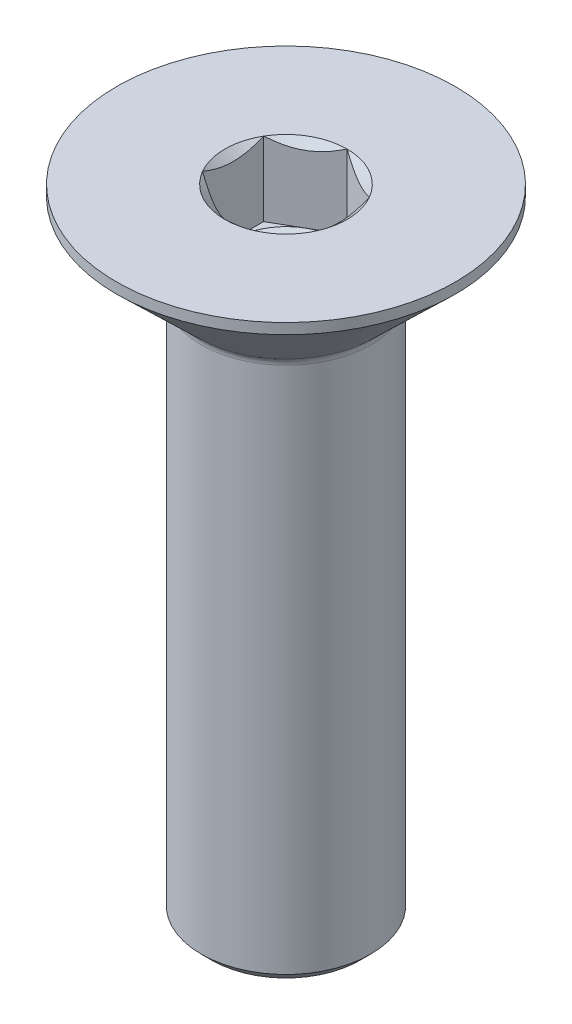
ISO-10303-21;
HEADER;
FILE_DESCRIPTION(('STEP AP214'),'2;1');
FILE_NAME('part.step','',(''),(''),'','','');
FILE_SCHEMA(('AUTOMOTIVE_DESIGN { 1 0 10303 214 1 1 1 1 }'));
ENDSEC;
DATA;
#1=APPLICATION_CONTEXT('core data for automotive mechanical design processes');
#2=APPLICATION_PROTOCOL_DEFINITION('international standard','automotive_design',2000,#1);
#3=PRODUCT_CONTEXT('',#1,'mechanical');
#4=PRODUCT('Part','Part','',(#3));
#5=PRODUCT_RELATED_PRODUCT_CATEGORY('part','',(#4));
#6=PRODUCT_DEFINITION_FORMATION('','',#4);
#7=PRODUCT_DEFINITION_CONTEXT('part definition',#1,'design');
#8=PRODUCT_DEFINITION('design','',#6,#7);
#9=PRODUCT_DEFINITION_SHAPE('','',#8);
#10=(LENGTH_UNIT() NAMED_UNIT(*) SI_UNIT(.MILLI.,.METRE.));
#11=(NAMED_UNIT(*) PLANE_ANGLE_UNIT() SI_UNIT($,.RADIAN.));
#12=(NAMED_UNIT(*) SI_UNIT($,.STERADIAN.) SOLID_ANGLE_UNIT());
#13=UNCERTAINTY_MEASURE_WITH_UNIT(LENGTH_MEASURE(1.E-05),#10,'distance_accuracy_value','');
#14=(GEOMETRIC_REPRESENTATION_CONTEXT(3) GLOBAL_UNCERTAINTY_ASSIGNED_CONTEXT((#13)) GLOBAL_UNIT_ASSIGNED_CONTEXT((#10,
#11,#12)) REPRESENTATION_CONTEXT('',''));
#15=CARTESIAN_POINT('',(0.,0.,0.));
#16=DIRECTION('',(0.,0.,1.));
#17=DIRECTION('',(1.,0.,0.));
#18=AXIS2_PLACEMENT_3D('',#15,#16,#17);
#19=CARTESIAN_POINT('',(0.,-3.5,0.));
#20=DIRECTION('',(0.,1.,0.));
#21=DIRECTION('',(0.,0.,1.));
#22=AXIS2_PLACEMENT_3D('',#19,#20,#21);
#23=PLANE('',#22);
#24=CARTESIAN_POINT('',(0.,-3.5,0.));
#25=DIRECTION('',(0.,1.,0.));
#26=DIRECTION('',(0.,0.,1.));
#27=AXIS2_PLACEMENT_3D('',#24,#25,#26);
#28=CIRCLE('',#27,2.5);
#29=CARTESIAN_POINT('',(1.25,-3.5,2.1650635094611));
#30=VERTEX_POINT('',#29);
#31=CARTESIAN_POINT('',(2.5,-3.5,0.));
#32=VERTEX_POINT('',#31);
#33=EDGE_CURVE('E161',#30,#32,#28,.T.);
#34=ORIENTED_EDGE('',*,*,#33,.F.);
#35=DIRECTION('',(0.866025403784439,0.,-0.5));
#36=VECTOR('',#35,1.);
#37=CARTESIAN_POINT('',(0.,-3.5,2.88675134594813));
#38=LINE('',#37,#36);
#39=CARTESIAN_POINT('',(2.5,-3.5,1.44337567297407));
#40=VERTEX_POINT('',#39);
#41=EDGE_CURVE('E192',#30,#40,#38,.T.);
#42=ORIENTED_EDGE('',*,*,#41,.T.);
#43=DIRECTION('',(0.,0.,-1.));
#44=VECTOR('',#43,1.);
#45=CARTESIAN_POINT('',(2.5,-3.5,1.44337567297407));
#46=LINE('',#45,#44);
#47=EDGE_CURVE('E187',#40,#32,#46,.T.);
#48=ORIENTED_EDGE('',*,*,#47,.T.);
#49=EDGE_LOOP('',(#34,#42,#48));
#50=FACE_BOUND('',#49,.T.);
#51=ADVANCED_FACE('F45',(#50),#23,.T.);
#52=CARTESIAN_POINT('',(0.,-3.5,0.));
#53=DIRECTION('',(0.,1.,0.));
#54=DIRECTION('',(0.,0.,1.));
#55=AXIS2_PLACEMENT_3D('',#52,#53,#54);
#56=CIRCLE('',#55,2.5);
#57=CARTESIAN_POINT('',(1.25,-3.5,-2.1650635094611));
#58=VERTEX_POINT('',#57);
#59=EDGE_CURVE('E163',#32,#58,#56,.T.);
#60=ORIENTED_EDGE('',*,*,#59,.F.);
#61=CARTESIAN_POINT('',(2.5,-3.5,-1.44337567297407));
#62=VERTEX_POINT('',#61);
#63=EDGE_CURVE('E177',#32,#62,#46,.T.);
#64=ORIENTED_EDGE('',*,*,#63,.T.);
#65=DIRECTION('',(-0.866025403784439,0.,-0.5));
#66=VECTOR('',#65,1.);
#67=CARTESIAN_POINT('',(2.5,-3.5,-1.44337567297407));
#68=LINE('',#67,#66);
#69=EDGE_CURVE('E180',#62,#58,#68,.T.);
#70=ORIENTED_EDGE('',*,*,#69,.T.);
#71=EDGE_LOOP('',(#60,#64,#70));
#72=FACE_BOUND('',#71,.T.);
#73=ADVANCED_FACE('F176',(#72),#23,.T.);
#74=CARTESIAN_POINT('',(-1.25,-3.5,-2.1650635094611));
#75=VERTEX_POINT('',#74);
#76=EDGE_CURVE('E182',#58,#75,#56,.T.);
#77=ORIENTED_EDGE('',*,*,#76,.F.);
#78=CARTESIAN_POINT('',(0.,-3.5,-2.88675134594813));
#79=VERTEX_POINT('',#78);
#80=EDGE_CURVE('E223',#58,#79,#68,.T.);
#81=ORIENTED_EDGE('',*,*,#80,.T.);
#82=DIRECTION('',(-0.866025403784439,0.,0.5));
#83=VECTOR('',#82,1.);
#84=CARTESIAN_POINT('',(0.,-3.5,-2.88675134594813));
#85=LINE('',#84,#83);
#86=EDGE_CURVE('E352',#79,#75,#85,.T.);
#87=ORIENTED_EDGE('',*,*,#86,.T.);
#88=EDGE_LOOP('',(#77,#81,#87));
#89=FACE_BOUND('',#88,.T.);
#90=ADVANCED_FACE('F324',(#89),#23,.T.);
#91=CARTESIAN_POINT('',(-2.5,-3.5,0.));
#92=VERTEX_POINT('',#91);
#93=EDGE_CURVE('E348',#75,#92,#56,.T.);
#94=ORIENTED_EDGE('',*,*,#93,.F.);
#95=CARTESIAN_POINT('',(-2.5,-3.5,-1.44337567297407));
#96=VERTEX_POINT('',#95);
#97=EDGE_CURVE('E356',#75,#96,#85,.T.);
#98=ORIENTED_EDGE('',*,*,#97,.T.);
#99=DIRECTION('',(0.,0.,1.));
#100=VECTOR('',#99,1.);
#101=CARTESIAN_POINT('',(-2.5,-3.5,-1.44337567297407));
#102=LINE('',#101,#100);
#103=EDGE_CURVE('E351',#96,#92,#102,.T.);
#104=ORIENTED_EDGE('',*,*,#103,.T.);
#105=EDGE_LOOP('',(#94,#98,#104));
#106=FACE_BOUND('',#105,.T.);
#107=ADVANCED_FACE('F332',(#106),#23,.T.);
#108=CARTESIAN_POINT('',(-1.25,-3.5,2.1650635094611));
#109=VERTEX_POINT('',#108);
#110=EDGE_CURVE('E241',#92,#109,#56,.T.);
#111=ORIENTED_EDGE('',*,*,#110,.F.);
#112=CARTESIAN_POINT('',(-2.5,-3.5,1.44337567297406));
#113=VERTEX_POINT('',#112);
#114=EDGE_CURVE('E344',#92,#113,#102,.T.);
#115=ORIENTED_EDGE('',*,*,#114,.T.);
#116=DIRECTION('',(0.866025403784439,0.,0.5));
#117=VECTOR('',#116,1.);
#118=CARTESIAN_POINT('',(-2.5,-3.5,1.44337567297406));
#119=LINE('',#118,#117);
#120=EDGE_CURVE('E347',#113,#109,#119,.T.);
#121=ORIENTED_EDGE('',*,*,#120,.T.);
#122=EDGE_LOOP('',(#111,#115,#121));
#123=FACE_BOUND('',#122,.T.);
#124=ADVANCED_FACE('F327',(#123),#23,.T.);
#125=CARTESIAN_POINT('',(0.,0.,0.));
#126=DIRECTION('',(0.,-1.,0.));
#127=DIRECTION('',(0.,0.,-1.));
#128=AXIS2_PLACEMENT_3D('',#125,#126,#127);
#129=PLANE('',#128);
#130=DIRECTION('',(-0.866025403784439,0.,-0.5));
#131=VECTOR('',#130,1.);
#132=CARTESIAN_POINT('',(2.5,0.,-1.44337567297407));
#133=LINE('',#132,#131);
#134=CARTESIAN_POINT('',(0.00303618737350591,0.,-2.88499840235073));
#135=VERTEX_POINT('',#134);
#136=CARTESIAN_POINT('',(0.,0.,-2.88675134594813));
#137=VERTEX_POINT('',#136);
#138=EDGE_CURVE('E204',#135,#137,#133,.T.);
#139=ORIENTED_EDGE('',*,*,#138,.F.);
#140=CARTESIAN_POINT('',(0.,0.,0.));
#141=DIRECTION('',(0.,1.,0.));
#142=DIRECTION('',(0.,0.,1.));
#143=AXIS2_PLACEMENT_3D('',#140,#141,#142);
#144=CIRCLE('',#143,2.885);
#145=CARTESIAN_POINT('',(2.49696381262649,0.,-1.44512861657147));
#146=VERTEX_POINT('',#145);
#147=EDGE_CURVE('E375',#146,#135,#144,.T.);
#148=ORIENTED_EDGE('',*,*,#147,.F.);
#149=CARTESIAN_POINT('',(2.5,0.,-1.44337567297407));
#150=VERTEX_POINT('',#149);
#151=EDGE_CURVE('E201',#150,#146,#133,.T.);
#152=ORIENTED_EDGE('',*,*,#151,.F.);
#153=DIRECTION('',(0.,0.,-1.));
#154=VECTOR('',#153,1.);
#155=CARTESIAN_POINT('',(2.5,0.,1.44337567297407));
#156=LINE('',#155,#154);
#157=CARTESIAN_POINT('',(2.5,0.,-1.43986978577926));
#158=VERTEX_POINT('',#157);
#159=EDGE_CURVE('E220',#158,#150,#156,.T.);
#160=ORIENTED_EDGE('',*,*,#159,.F.);
#161=CARTESIAN_POINT('',(2.5,0.,1.43986978577926));
#162=VERTEX_POINT('',#161);
#163=EDGE_CURVE('E372',#162,#158,#144,.T.);
#164=ORIENTED_EDGE('',*,*,#163,.F.);
#165=CARTESIAN_POINT('',(2.5,0.,1.44337567297407));
#166=VERTEX_POINT('',#165);
#167=EDGE_CURVE('E221',#166,#162,#156,.T.);
#168=ORIENTED_EDGE('',*,*,#167,.F.);
#169=DIRECTION('',(0.866025403784439,0.,-0.5));
#170=VECTOR('',#169,1.);
#171=CARTESIAN_POINT('',(0.,0.,2.88675134594813));
#172=LINE('',#171,#170);
#173=CARTESIAN_POINT('',(2.4969638126265,0.,1.44512861657147));
#174=VERTEX_POINT('',#173);
#175=EDGE_CURVE('E216',#174,#166,#172,.T.);
#176=ORIENTED_EDGE('',*,*,#175,.F.);
#177=CARTESIAN_POINT('',(0.00303618737350635,0.,2.88499840235073));
#178=VERTEX_POINT('',#177);
#179=EDGE_CURVE('E171',#178,#174,#144,.T.);
#180=ORIENTED_EDGE('',*,*,#179,.F.);
#181=CARTESIAN_POINT('',(0.,0.,2.88675134594813));
#182=VERTEX_POINT('',#181);
#183=EDGE_CURVE('E217',#182,#178,#172,.T.);
#184=ORIENTED_EDGE('',*,*,#183,.F.);
#185=DIRECTION('',(0.866025403784439,0.,0.5));
#186=VECTOR('',#185,1.);
#187=CARTESIAN_POINT('',(-2.5,0.,1.44337567297406));
#188=LINE('',#187,#186);
#189=CARTESIAN_POINT('',(-0.00303618737350505,0.,2.88499840235073));
#190=VERTEX_POINT('',#189);
#191=EDGE_CURVE('E212',#190,#182,#188,.T.);
#192=ORIENTED_EDGE('',*,*,#191,.F.);
#193=CARTESIAN_POINT('',(-2.49696381262649,0.,1.44512861657147));
#194=VERTEX_POINT('',#193);
#195=EDGE_CURVE('E378',#194,#190,#144,.T.);
#196=ORIENTED_EDGE('',*,*,#195,.F.);
#197=CARTESIAN_POINT('',(-2.5,0.,1.44337567297406));
#198=VERTEX_POINT('',#197);
#199=EDGE_CURVE('E213',#198,#194,#188,.T.);
#200=ORIENTED_EDGE('',*,*,#199,.F.);
#201=DIRECTION('',(0.,0.,1.));
#202=VECTOR('',#201,1.);
#203=CARTESIAN_POINT('',(-2.5,0.,-1.44337567297407));
#204=LINE('',#203,#202);
#205=CARTESIAN_POINT('',(-2.5,0.,1.43986978577926));
#206=VERTEX_POINT('',#205);
#207=EDGE_CURVE('E208',#206,#198,#204,.T.);
#208=ORIENTED_EDGE('',*,*,#207,.F.);
#209=CARTESIAN_POINT('',(-2.5,0.,-1.43986978577926));
#210=VERTEX_POINT('',#209);
#211=EDGE_CURVE('E381',#210,#206,#144,.T.);
#212=ORIENTED_EDGE('',*,*,#211,.F.);
#213=CARTESIAN_POINT('',(-2.5,0.,-1.44337567297407));
#214=VERTEX_POINT('',#213);
#215=EDGE_CURVE('E209',#214,#210,#204,.T.);
#216=ORIENTED_EDGE('',*,*,#215,.F.);
#217=DIRECTION('',(-0.866025403784439,0.,0.5));
#218=VECTOR('',#217,1.);
#219=CARTESIAN_POINT('',(0.,0.,-2.88675134594813));
#220=LINE('',#219,#218);
#221=CARTESIAN_POINT('',(-2.49696381262649,0.,-1.44512861657147));
#222=VERTEX_POINT('',#221);
#223=EDGE_CURVE('E203',#222,#214,#220,.T.);
#224=ORIENTED_EDGE('',*,*,#223,.F.);
#225=CARTESIAN_POINT('',(-0.00303618737350808,0.,-2.88499840235073));
#226=VERTEX_POINT('',#225);
#227=EDGE_CURVE('E379',#226,#222,#144,.T.);
#228=ORIENTED_EDGE('',*,*,#227,.F.);
#229=EDGE_CURVE('E205',#137,#226,#220,.T.);
#230=ORIENTED_EDGE('',*,*,#229,.F.);
#231=EDGE_LOOP('',(#139,#148,#152,#160,#164,#168,#176,#180,#184,#192,#196,#200,#208,#212,#216,
#224,#228,#230));
#232=FACE_BOUND('',#231,.T.);
#233=CARTESIAN_POINT('',(0.,0.,0.));
#234=DIRECTION('',(0.,-1.,0.));
#235=DIRECTION('',(0.,0.,-1.));
#236=AXIS2_PLACEMENT_3D('',#233,#234,#235);
#237=CIRCLE('',#236,8.);
#238=CARTESIAN_POINT('',(0.,0.,-8.));
#239=VERTEX_POINT('',#238);
#240=EDGE_CURVE('E238',#239,#239,#237,.T.);
#241=ORIENTED_EDGE('',*,*,#240,.F.);
#242=EDGE_LOOP('',(#241));
#243=FACE_BOUND('',#242,.T.);
#244=ADVANCED_FACE('F331',(#232,#243),#129,.F.);
#245=CARTESIAN_POINT('',(0.,0.,0.));
#246=DIRECTION('',(0.,-1.,0.));
#247=DIRECTION('',(0.,0.,-1.));
#248=AXIS2_PLACEMENT_3D('',#245,#246,#247);
#249=CYLINDRICAL_SURFACE('',#248,8.);
#250=CARTESIAN_POINT('',(0.,-0.500000000000001,0.));
#251=DIRECTION('',(0.,-1.,0.));
#252=DIRECTION('',(0.,0.,-1.));
#253=AXIS2_PLACEMENT_3D('',#250,#251,#252);
#254=CIRCLE('',#253,8.);
#255=CARTESIAN_POINT('',(0.,-0.500000000000001,-8.));
#256=VERTEX_POINT('',#255);
#257=EDGE_CURVE('E225',#256,#256,#254,.T.);
#258=ORIENTED_EDGE('',*,*,#257,.F.);
#259=EDGE_LOOP('',(#258));
#260=FACE_BOUND('',#259,.T.);
#261=ORIENTED_EDGE('',*,*,#240,.T.);
#262=EDGE_LOOP('',(#261));
#263=FACE_BOUND('',#262,.T.);
#264=ADVANCED_FACE('F338',(#260,#263),#249,.T.);
#265=CARTESIAN_POINT('',(0.,-0.500000000000001,0.));
#266=DIRECTION('',(0.,1.,0.));
#267=DIRECTION('',(0.,0.,1.));
#268=AXIS2_PLACEMENT_3D('',#265,#266,#267);
#269=CONICAL_SURFACE('',#268,8.,0.802851455917386);
#270=CARTESIAN_POINT('',(0.,-4.21532260716382,0.));
#271=DIRECTION('',(0.,1.,0.));
#272=DIRECTION('',(0.,0.,1.));
#273=AXIS2_PLACEMENT_3D('',#270,#271,#272);
#274=CIRCLE('',#273,4.1526708147705);
#275=CARTESIAN_POINT('',(0.,-4.21532260716382,4.1526708147705));
#276=VERTEX_POINT('',#275);
#277=EDGE_CURVE('E592',#276,#276,#274,.T.);
#278=ORIENTED_EDGE('',*,*,#277,.T.);
#279=EDGE_LOOP('',(#278));
#280=FACE_BOUND('',#279,.T.);
#281=ORIENTED_EDGE('',*,*,#257,.T.);
#282=EDGE_LOOP('',(#281));
#283=FACE_BOUND('',#282,.T.);
#284=ADVANCED_FACE('F425',(#280,#283),#269,.T.);
#285=CARTESIAN_POINT('',(0.,0.,0.));
#286=DIRECTION('',(0.,-1.,0.));
#287=DIRECTION('',(0.,0.,-1.));
#288=AXIS2_PLACEMENT_3D('',#285,#286,#287);
#289=CYLINDRICAL_SURFACE('',#288,4.);
#290=CARTESIAN_POINT('',(0.,-29.5,0.));
#291=DIRECTION('',(0.,1.,0.));
#292=DIRECTION('',(0.,0.,1.));
#293=AXIS2_PLACEMENT_3D('',#290,#291,#292);
#294=CIRCLE('',#293,4.);
#295=CARTESIAN_POINT('',(0.,-29.5,4.));
#296=VERTEX_POINT('',#295);
#297=EDGE_CURVE('E11',#296,#296,#294,.T.);
#298=ORIENTED_EDGE('',*,*,#297,.T.);
#299=EDGE_LOOP('',(#298));
#300=FACE_BOUND('',#299,.T.);
#301=CARTESIAN_POINT('',(0.,-4.57499250733314,0.));
#302=DIRECTION('',(0.,-1.,0.));
#303=DIRECTION('',(0.,0.,-1.));
#304=AXIS2_PLACEMENT_3D('',#301,#302,#303);
#305=CIRCLE('',#304,4.);
#306=CARTESIAN_POINT('',(0.,-4.57499250733314,-4.));
#307=VERTEX_POINT('',#306);
#308=EDGE_CURVE('E250',#307,#307,#305,.T.);
#309=ORIENTED_EDGE('',*,*,#308,.T.);
#310=EDGE_LOOP('',(#309));
#311=FACE_BOUND('',#310,.T.);
#312=ADVANCED_FACE('F429',(#300,#311),#289,.T.);
#313=CARTESIAN_POINT('',(-4.,-30.,0.));
#314=DIRECTION('',(0.,1.,0.));
#315=DIRECTION('',(0.,0.,1.));
#316=AXIS2_PLACEMENT_3D('',#313,#314,#315);
#317=PLANE('',#316);
#318=CARTESIAN_POINT('',(0.,-30.,0.));
#319=DIRECTION('',(0.,1.,0.));
#320=DIRECTION('',(0.,0.,1.));
#321=AXIS2_PLACEMENT_3D('',#318,#319,#320);
#322=CIRCLE('',#321,3.5);
#323=CARTESIAN_POINT('',(0.,-30.,3.5));
#324=VERTEX_POINT('',#323);
#325=EDGE_CURVE('E54',#324,#324,#322,.F.);
#326=ORIENTED_EDGE('',*,*,#325,.T.);
#327=EDGE_LOOP('',(#326));
#328=FACE_BOUND('',#327,.T.);
#329=ADVANCED_FACE('F448',(#328),#317,.F.);
#330=CARTESIAN_POINT('',(2.5,-3.5,-1.44337567297407));
#331=DIRECTION('',(0.5,0.,-0.866025403784439));
#332=DIRECTION('',(-0.866025403784439,0.,-0.5));
#333=AXIS2_PLACEMENT_3D('',#330,#331,#332);
#334=PLANE('',#333);
#335=ORIENTED_EDGE('',*,*,#80,.F.);
#336=ORIENTED_EDGE('',*,*,#69,.F.);
#337=DIRECTION('',(0.,1.,0.));
#338=VECTOR('',#337,1.);
#339=CARTESIAN_POINT('',(2.5,-3.5,-1.44337567297407));
#340=LINE('',#339,#338);
#341=EDGE_CURVE('E189',#62,#150,#340,.T.);
#342=ORIENTED_EDGE('',*,*,#341,.T.);
#343=ORIENTED_EDGE('',*,*,#151,.T.);
#344=CARTESIAN_POINT('',(2.4973773508226,0.000200000000487748,-1.44488986018263));
#345=CARTESIAN_POINT('',(2.41327882052173,-0.0404569334588348,-1.49344416929029));
#346=CARTESIAN_POINT('',(2.32815615422779,-0.0785635697040059,-1.54258976358923));
#347=CARTESIAN_POINT('',(2.15562470900219,-0.148208322096178,-1.64220083993391));
#348=CARTESIAN_POINT('',(2.06820942804733,-0.179724800980096,-1.69267007592448));
#349=CARTESIAN_POINT('',(1.89220816500462,-0.234187523234035,-1.79428445251991));
#350=CARTESIAN_POINT('',(1.80364021302484,-0.257209544370802,-1.84541918343701));
#351=CARTESIAN_POINT('',(1.62509584020347,-0.29348007349943,-1.94850182514771));
#352=CARTESIAN_POINT('',(1.53512127325754,-0.306740493273772,-2.00044866559417));
#353=CARTESIAN_POINT('',(1.35290085289256,-0.322555345730019,-2.10565367434374));
#354=CARTESIAN_POINT('',(1.26064245725723,-0.324923004464669,-2.1589190838988));
#355=CARTESIAN_POINT('',(1.0764066346981,-0.318214015083625,-2.26528768564768));
#356=CARTESIAN_POINT('',(0.98442935041781,-0.309132294506027,-2.31839079548624));
#357=CARTESIAN_POINT('',(0.801764582037729,-0.280351543501791,-2.42385234868194));
#358=CARTESIAN_POINT('',(0.711077084984826,-0.260652619779317,-2.47621079951757));
#359=CARTESIAN_POINT('',(0.531542036785383,-0.212150478668656,-2.57986540792449));
#360=CARTESIAN_POINT('',(0.442695278442676,-0.183343421844035,-2.63116110777028));
#361=CARTESIAN_POINT('',(0.295140967125742,-0.128723720535224,-2.7163516291292));
#362=CARTESIAN_POINT('',(0.235868917696128,-0.104892376654611,-2.75057236282281));
#363=CARTESIAN_POINT('',(0.118477847133646,-0.0543834029429051,-2.81834812901251));
#364=CARTESIAN_POINT('',(0.0603554810710586,-0.0277161722241963,-2.85190509270468));
#365=CARTESIAN_POINT('',(0.00268701000224341,0.000168869821637936,-2.88520000000002));
#366=B_SPLINE_CURVE_WITH_KNOTS('',3,(#344,#345,#346,#347,#348,#349,#350,#351,#352,#353,#354,
#355,#356,#357,#358,#359,#360,#361,#362,#363,#364,#365),.UNSPECIFIED.,.F.,.F.,(4,2,2,2,2,2,2,2,
2,2,4),(0.,0.31595186861679,0.632925345744124,0.946998565115361,1.2606878923813,
1.57973636224577,1.89892623104832,2.21811289201422,2.53743428250574,2.75478670678785,
2.97136792908737),.UNSPECIFIED.);
#367=EDGE_CURVE('E61',#146,#135,#366,.T.);
#368=ORIENTED_EDGE('',*,*,#367,.T.);
#369=ORIENTED_EDGE('',*,*,#138,.T.);
#370=DIRECTION('',(0.,1.,0.));
#371=VECTOR('',#370,1.);
#372=CARTESIAN_POINT('',(0.,-3.5,-2.88675134594813));
#373=LINE('',#372,#371);
#374=EDGE_CURVE('E194',#79,#137,#373,.T.);
#375=ORIENTED_EDGE('',*,*,#374,.F.);
#376=EDGE_LOOP('',(#335,#336,#342,#343,#368,#369,#375));
#377=FACE_BOUND('',#376,.T.);
#378=ADVANCED_FACE('F302',(#377),#334,.F.);
#379=CARTESIAN_POINT('',(2.5,-3.5,1.44337567297407));
#380=DIRECTION('',(1.,0.,0.));
#381=DIRECTION('',(0.,0.,-1.));
#382=AXIS2_PLACEMENT_3D('',#379,#380,#381);
#383=PLANE('',#382);
#384=ORIENTED_EDGE('',*,*,#63,.F.);
#385=ORIENTED_EDGE('',*,*,#47,.F.);
#386=DIRECTION('',(0.,1.,0.));
#387=VECTOR('',#386,1.);
#388=CARTESIAN_POINT('',(2.5,-3.5,1.44337567297407));
#389=LINE('',#388,#387);
#390=EDGE_CURVE('E226',#40,#166,#389,.T.);
#391=ORIENTED_EDGE('',*,*,#390,.T.);
#392=ORIENTED_EDGE('',*,*,#167,.T.);
#393=CARTESIAN_POINT('',(2.5,1.78794282978778,4.34834705906464));
#394=CARTESIAN_POINT('',(2.5,1.68169496815112,4.20220965151823));
#395=CARTESIAN_POINT('',(2.5,1.5762372981594,4.05548274009671));
#396=CARTESIAN_POINT('',(2.5,1.36756651650837,3.76031170165135));
#397=CARTESIAN_POINT('',(2.5,1.26435479361267,3.61186659447911));
#398=CARTESIAN_POINT('',(2.5,1.05567600905998,3.30511415915437));
#399=CARTESIAN_POINT('',(2.5,0.950371227547658,3.14669570257551));
#400=CARTESIAN_POINT('',(2.5,0.744546687464796,2.82682285332835));
#401=CARTESIAN_POINT('',(2.5,0.644025730918847,2.66536923501032));
#402=CARTESIAN_POINT('',(2.5,0.449501531180866,2.33766702066841));
#403=CARTESIAN_POINT('',(2.5,0.35552479586833,2.17140239382209));
#404=CARTESIAN_POINT('',(2.5,0.222463573498417,1.91770337083624));
#405=CARTESIAN_POINT('',(2.5,0.179400289326376,1.83235991488216));
#406=CARTESIAN_POINT('',(2.5,0.0966150951357633,1.66007440696253));
#407=CARTESIAN_POINT('',(2.5,0.0568925793969845,1.57313264828648));
#408=CARTESIAN_POINT('',(2.5,-0.0174975386433119,1.39955994552833));
#409=CARTESIAN_POINT('',(2.5,-0.0522634536064547,1.31297146709486));
#410=CARTESIAN_POINT('',(2.5,-0.116900910942093,1.1379576675113));
#411=CARTESIAN_POINT('',(2.5,-0.14677198145873,1.04953217019997));
#412=CARTESIAN_POINT('',(2.5,-0.200456048925851,0.871084581268407));
#413=CARTESIAN_POINT('',(2.5,-0.224284477026103,0.781067197510422));
#414=CARTESIAN_POINT('',(2.5,-0.264836660369855,0.599470106751108));
#415=CARTESIAN_POINT('',(2.5,-0.281563979822721,0.507891207577059));
#416=CARTESIAN_POINT('',(2.5,-0.308171484400439,0.314541437507823));
#417=CARTESIAN_POINT('',(2.5,-0.317218583956524,0.212652364441019));
#418=CARTESIAN_POINT('',(2.5,-0.324787290535766,0.00847160665878364));
#419=CARTESIAN_POINT('',(2.5,-0.323308389793052,-0.0938200972413426));
#420=CARTESIAN_POINT('',(2.5,-0.309930574566456,-0.298082000786522));
#421=CARTESIAN_POINT('',(2.5,-0.297993390924526,-0.400049637845693));
#422=CARTESIAN_POINT('',(2.5,-0.264622030655831,-0.602402840026521));
#423=CARTESIAN_POINT('',(2.5,-0.24318543616509,-0.702787995621913));
#424=CARTESIAN_POINT('',(2.5,-0.180047033579252,-0.94909829609655));
#425=CARTESIAN_POINT('',(2.5,-0.133556729381696,-1.0937851168832));
#426=CARTESIAN_POINT('',(2.5,-0.0277410831809869,-1.37836961431639));
#427=CARTESIAN_POINT('',(2.5,0.0315969418302004,-1.51826239918494));
#428=CARTESIAN_POINT('',(2.5,0.159908439406324,-1.79515440022489));
#429=CARTESIAN_POINT('',(2.5,0.228970466820301,-1.9321119395906));
#430=CARTESIAN_POINT('',(2.5,0.373539003458206,-2.20246176621535));
#431=CARTESIAN_POINT('',(2.5,0.449042803651663,-2.33585552150244));
#432=CARTESIAN_POINT('',(2.5,0.62409031362706,-2.63281587784692));
#433=CARTESIAN_POINT('',(2.5,0.724933563016396,-2.79561138067593));
#434=CARTESIAN_POINT('',(2.5,0.93156057216485,-3.11806711665424));
#435=CARTESIAN_POINT('',(2.5,1.03734566506003,-3.27772648709187));
#436=CARTESIAN_POINT('',(2.5,1.24935372161516,-3.59017919142311));
#437=CARTESIAN_POINT('',(2.5,1.35547928270393,-3.74303886680748));
#438=CARTESIAN_POINT('',(2.5,1.51645022204685,-3.97098730878423));
#439=CARTESIAN_POINT('',(2.5,1.5703860982077,-4.04672168805424));
#440=CARTESIAN_POINT('',(2.5,1.67878645352582,-4.19780817868253));
#441=CARTESIAN_POINT('',(2.5,1.73325091814069,-4.27316030047102));
#442=CARTESIAN_POINT('',(2.5,1.78794282978778,-4.34834705906464));
#443=B_SPLINE_CURVE_WITH_KNOTS('',3,(#393,#394,#395,#396,#397,#398,#399,#400,#401,#402,#403,
#404,#405,#406,#407,#408,#409,#410,#411,#412,#413,#414,#415,#416,#417,#418,#419,#420,#421,#422,
#423,#424,#425,#426,#427,#428,#429,#430,#431,#432,#433,#434,#435,#436,#437,#438,#439,#440,#441,
#442),.UNSPECIFIED.,.F.,.F.,(4,2,2,2,2,2,2,2,2,2,2,2,2,2,2,2,2,2,2,2,2,2,2,2,4),(0.,
0.542050726813787,1.08442761301437,1.65503835105581,2.22550543544546,2.79816292706285,
3.08488582545087,3.37155662505943,3.6513587103434,3.93118775229277,4.21029482802617,
4.48926164740529,4.79560625127999,5.10196563307457,5.4094507555392,5.71701418650281,
6.17201892151662,6.62747489268199,7.08738499533085,7.54710263132009,8.12146204145801,
8.69597729858375,9.25420798748851,9.5331381734288,9.81206070713742),.UNSPECIFIED.);
#444=EDGE_CURVE('E69',#162,#158,#443,.T.);
#445=ORIENTED_EDGE('',*,*,#444,.T.);
#446=ORIENTED_EDGE('',*,*,#159,.T.);
#447=ORIENTED_EDGE('',*,*,#341,.F.);
#448=EDGE_LOOP('',(#384,#385,#391,#392,#445,#446,#447));
#449=FACE_BOUND('',#448,.T.);
#450=ADVANCED_FACE('F185',(#449),#383,.F.);
#451=CARTESIAN_POINT('',(0.,-3.5,2.88675134594813));
#452=DIRECTION('',(0.5,0.,0.866025403784439));
#453=DIRECTION('',(0.866025403784439,0.,-0.5));
#454=AXIS2_PLACEMENT_3D('',#451,#452,#453);
#455=PLANE('',#454);
#456=ORIENTED_EDGE('',*,*,#41,.F.);
#457=CARTESIAN_POINT('',(0.,-3.5,2.88675134594813));
#458=VERTEX_POINT('',#457);
#459=EDGE_CURVE('E190',#458,#30,#38,.T.);
#460=ORIENTED_EDGE('',*,*,#459,.F.);
#461=DIRECTION('',(0.,1.,0.));
#462=VECTOR('',#461,1.);
#463=CARTESIAN_POINT('',(0.,-3.5,2.88675134594813));
#464=LINE('',#463,#462);
#465=EDGE_CURVE('E228',#458,#182,#464,.T.);
#466=ORIENTED_EDGE('',*,*,#465,.T.);
#467=ORIENTED_EDGE('',*,*,#183,.T.);
#468=CARTESIAN_POINT('',(0.00268701000227426,0.000168869821755772,2.8852));
#469=CARTESIAN_POINT('',(0.0867843321900494,-0.040485912961113,2.83664638839676));
#470=CARTESIAN_POINT('',(0.171905779482433,-0.078590325549836,2.78750149788869));
#471=CARTESIAN_POINT('',(0.344434688513993,-0.148230528913225,2.68789188581633));
#472=CARTESIAN_POINT('',(0.43184865160053,-0.179744683576388,2.63742341069739));
#473=CARTESIAN_POINT('',(0.607846989648043,-0.234202701986237,2.53581072284873));
#474=CARTESIAN_POINT('',(0.696413331917569,-0.257222359610918,2.48467692129828));
#475=CARTESIAN_POINT('',(0.874954304093816,-0.293488326034234,2.38159624295094));
#476=CARTESIAN_POINT('',(0.964927080409235,-0.306746545936949,2.3296504363255));
#477=CARTESIAN_POINT('',(1.14714353480187,-0.322557312091336,2.22444771733113));
#478=CARTESIAN_POINT('',(1.23939975043016,-0.324923109630334,2.17118356640372));
#479=CARTESIAN_POINT('',(1.42363107378326,-0.318210997372521,2.06481756227265));
#480=CARTESIAN_POINT('',(1.51560603879515,-0.309128015123139,2.01171579146433));
#481=CARTESIAN_POINT('',(1.6982662361331,-0.280345388512879,1.90625687736103));
#482=CARTESIAN_POINT('',(1.78895147999612,-0.260645839181895,1.85389972740519));
#483=CARTESIAN_POINT('',(1.96848207083753,-0.212143027346144,1.75024769245513));
#484=CARTESIAN_POINT('',(2.05732662500231,-0.183335925503686,1.69895326519206));
#485=CARTESIAN_POINT('',(2.20488649706324,-0.128713137114628,1.6137595333361));
#486=CARTESIAN_POINT('',(2.26416613490705,-0.104878101894069,1.57953441846951));
#487=CARTESIAN_POINT('',(2.38157207016194,-0.0543611236697518,1.51175007014564));
#488=CARTESIAN_POINT('',(2.43970171407944,-0.0276895843561054,1.47818890458197));
#489=CARTESIAN_POINT('',(2.49737735082263,0.000200000000369425,1.44488986018261));
#490=B_SPLINE_CURVE_WITH_KNOTS('',3,(#468,#469,#470,#471,#472,#473,#474,#475,#476,#477,#478,
#479,#480,#481,#482,#483,#484,#485,#486,#487,#488,#489),.UNSPECIFIED.,.F.,.F.,(4,2,2,2,2,2,2,2,
2,2,4),(0.,0.315945512423584,0.632912545248415,0.946978768239885,1.26066112322694,
1.57970196090643,1.89888420129765,2.21806358470594,2.53737769971006,2.75475856594857,
2.97136796172282),.UNSPECIFIED.);
#491=EDGE_CURVE('E282',#178,#174,#490,.T.);
#492=ORIENTED_EDGE('',*,*,#491,.T.);
#493=ORIENTED_EDGE('',*,*,#175,.T.);
#494=ORIENTED_EDGE('',*,*,#390,.F.);
#495=EDGE_LOOP('',(#456,#460,#466,#467,#492,#493,#494));
#496=FACE_BOUND('',#495,.T.);
#497=ADVANCED_FACE('F301',(#496),#455,.F.);
#498=CARTESIAN_POINT('',(-2.5,-3.5,1.44337567297406));
#499=DIRECTION('',(-0.5,0.,0.866025403784439));
#500=DIRECTION('',(0.866025403784439,0.,0.5));
#501=AXIS2_PLACEMENT_3D('',#498,#499,#500);
#502=PLANE('',#501);
#503=EDGE_CURVE('E358',#109,#458,#119,.T.);
#504=ORIENTED_EDGE('',*,*,#503,.F.);
#505=ORIENTED_EDGE('',*,*,#120,.F.);
#506=DIRECTION('',(0.,1.,0.));
#507=VECTOR('',#506,1.);
#508=CARTESIAN_POINT('',(-2.5,-3.5,1.44337567297406));
#509=LINE('',#508,#507);
#510=EDGE_CURVE('E231',#113,#198,#509,.T.);
#511=ORIENTED_EDGE('',*,*,#510,.T.);
#512=ORIENTED_EDGE('',*,*,#199,.T.);
#513=CARTESIAN_POINT('',(-2.4973773508226,0.000200000000487731,1.44488986018263));
#514=CARTESIAN_POINT('',(-2.41327882052173,-0.0404569334588345,1.49344416929028));
#515=CARTESIAN_POINT('',(-2.32815615422779,-0.0785635697040057,1.54258976358923));
#516=CARTESIAN_POINT('',(-2.15562470900219,-0.148208322096178,1.6422008399339));
#517=CARTESIAN_POINT('',(-2.06820942804733,-0.179724800980097,1.69267007592448));
#518=CARTESIAN_POINT('',(-1.89220816500462,-0.234187523234036,1.79428445251991));
#519=CARTESIAN_POINT('',(-1.80364021302484,-0.257209544370803,1.845419183437));
#520=CARTESIAN_POINT('',(-1.62509584020347,-0.29348007349943,1.94850182514771));
#521=CARTESIAN_POINT('',(-1.53512127325754,-0.306740493273772,2.00044866559417));
#522=CARTESIAN_POINT('',(-1.35290085289256,-0.322555345730019,2.10565367434374));
#523=CARTESIAN_POINT('',(-1.26064245725723,-0.32492300446467,2.1589190838988));
#524=CARTESIAN_POINT('',(-1.07640663469811,-0.318214015083626,2.26528768564768));
#525=CARTESIAN_POINT('',(-0.984429350417812,-0.309132294506028,2.31839079548624));
#526=CARTESIAN_POINT('',(-0.801764582037732,-0.280351543501791,2.42385234868194));
#527=CARTESIAN_POINT('',(-0.711077084984829,-0.260652619779318,2.47621079951756));
#528=CARTESIAN_POINT('',(-0.531542036785385,-0.212150478668657,2.57986540792449));
#529=CARTESIAN_POINT('',(-0.442695278442679,-0.183343421844037,2.63116110777027));
#530=CARTESIAN_POINT('',(-0.295140967125743,-0.128723720535225,2.71635162912919));
#531=CARTESIAN_POINT('',(-0.235868917696129,-0.104892376654612,2.7505723628228));
#532=CARTESIAN_POINT('',(-0.118477847133646,-0.0543834029429058,2.81834812901251));
#533=CARTESIAN_POINT('',(-0.0603554810710579,-0.0277161722241968,2.85190509270468));
#534=CARTESIAN_POINT('',(-0.00268701000224228,0.000168869821638075,2.88520000000002));
#535=B_SPLINE_CURVE_WITH_KNOTS('',3,(#513,#514,#515,#516,#517,#518,#519,#520,#521,#522,#523,
#524,#525,#526,#527,#528,#529,#530,#531,#532,#533,#534),.UNSPECIFIED.,.F.,.F.,(4,2,2,2,2,2,2,2,
2,2,4),(0.,0.31595186861679,0.632925345744125,0.946998565115361,1.2606878923813,
1.57973636224576,1.89892623104832,2.21811289201422,2.53743428250573,2.75478670678785,
2.97136792908737),.UNSPECIFIED.);
#536=EDGE_CURVE('E275',#194,#190,#535,.T.);
#537=ORIENTED_EDGE('',*,*,#536,.T.);
#538=ORIENTED_EDGE('',*,*,#191,.T.);
#539=ORIENTED_EDGE('',*,*,#465,.F.);
#540=EDGE_LOOP('',(#504,#505,#511,#512,#537,#538,#539));
#541=FACE_BOUND('',#540,.T.);
#542=ADVANCED_FACE('F305',(#541),#502,.F.);
#543=CARTESIAN_POINT('',(-2.5,-3.5,-1.44337567297407));
#544=DIRECTION('',(-1.,0.,0.));
#545=DIRECTION('',(0.,0.,1.));
#546=AXIS2_PLACEMENT_3D('',#543,#544,#545);
#547=PLANE('',#546);
#548=ORIENTED_EDGE('',*,*,#114,.F.);
#549=ORIENTED_EDGE('',*,*,#103,.F.);
#550=DIRECTION('',(0.,1.,0.));
#551=VECTOR('',#550,1.);
#552=CARTESIAN_POINT('',(-2.5,-3.5,-1.44337567297407));
#553=LINE('',#552,#551);
#554=EDGE_CURVE('E196',#96,#214,#553,.T.);
#555=ORIENTED_EDGE('',*,*,#554,.T.);
#556=ORIENTED_EDGE('',*,*,#215,.T.);
#557=CARTESIAN_POINT('',(-2.5,1.78794282978778,-4.34834705906463));
#558=CARTESIAN_POINT('',(-2.5,1.68169496815112,-4.20220965151823));
#559=CARTESIAN_POINT('',(-2.5,1.5762372981594,-4.0554827400967));
#560=CARTESIAN_POINT('',(-2.5,1.36756651650837,-3.76031170165135));
#561=CARTESIAN_POINT('',(-2.5,1.26435479361267,-3.61186659447911));
#562=CARTESIAN_POINT('',(-2.5,1.05567600905997,-3.30511415915437));
#563=CARTESIAN_POINT('',(-2.5,0.950371227547658,-3.1466957025755));
#564=CARTESIAN_POINT('',(-2.5,0.744546687464795,-2.82682285332835));
#565=CARTESIAN_POINT('',(-2.5,0.644025730918846,-2.66536923501032));
#566=CARTESIAN_POINT('',(-2.5,0.449501531180865,-2.33766702066841));
#567=CARTESIAN_POINT('',(-2.5,0.355524795868329,-2.17140239382208));
#568=CARTESIAN_POINT('',(-2.5,0.222463573498417,-1.91770337083624));
#569=CARTESIAN_POINT('',(-2.5,0.179400289326376,-1.83235991488215));
#570=CARTESIAN_POINT('',(-2.5,0.0966150951357632,-1.66007440696253));
#571=CARTESIAN_POINT('',(-2.5,0.0568925793969841,-1.57313264828648));
#572=CARTESIAN_POINT('',(-2.5,-0.017497538643312,-1.39955994552833));
#573=CARTESIAN_POINT('',(-2.5,-0.0522634536064543,-1.31297146709486));
#574=CARTESIAN_POINT('',(-2.5,-0.116900910942092,-1.13795766751129));
#575=CARTESIAN_POINT('',(-2.5,-0.146771981458729,-1.04953217019997));
#576=CARTESIAN_POINT('',(-2.5,-0.200456048925851,-0.871084581268405));
#577=CARTESIAN_POINT('',(-2.5,-0.224284477026102,-0.78106719751042));
#578=CARTESIAN_POINT('',(-2.5,-0.264836660369854,-0.599470106751106));
#579=CARTESIAN_POINT('',(-2.5,-0.281563979822721,-0.507891207577057));
#580=CARTESIAN_POINT('',(-2.5,-0.308171484400438,-0.31454143750782));
#581=CARTESIAN_POINT('',(-2.5,-0.317218583956523,-0.212652364441016));
#582=CARTESIAN_POINT('',(-2.5,-0.324787290535765,-0.00847160665878097));
#583=CARTESIAN_POINT('',(-2.5,-0.32330838979305,0.0938200972413456));
#584=CARTESIAN_POINT('',(-2.5,-0.309930574566455,0.298082000786525));
#585=CARTESIAN_POINT('',(-2.5,-0.297993390924525,0.400049637845695));
#586=CARTESIAN_POINT('',(-2.5,-0.264622030655829,0.602402840026524));
#587=CARTESIAN_POINT('',(-2.5,-0.243185436165089,0.702787995621916));
#588=CARTESIAN_POINT('',(-2.5,-0.18004703357925,0.949098296096552));
#589=CARTESIAN_POINT('',(-2.5,-0.133556729381694,1.0937851168832));
#590=CARTESIAN_POINT('',(-2.5,-0.0277410831809847,1.37836961431639));
#591=CARTESIAN_POINT('',(-2.5,0.0315969418302032,1.51826239918494));
#592=CARTESIAN_POINT('',(-2.5,0.159908439406328,1.79515440022489));
#593=CARTESIAN_POINT('',(-2.5,0.228970466820305,1.9321119395906));
#594=CARTESIAN_POINT('',(-2.5,0.37353900345821,2.20246176621536));
#595=CARTESIAN_POINT('',(-2.5,0.449042803651667,2.33585552150245));
#596=CARTESIAN_POINT('',(-2.5,0.624090313627065,2.63281587784692));
#597=CARTESIAN_POINT('',(-2.5,0.7249335630164,2.79561138067593));
#598=CARTESIAN_POINT('',(-2.5,0.931560572164853,3.11806711665425));
#599=CARTESIAN_POINT('',(-2.5,1.03734566506003,3.27772648709187));
#600=CARTESIAN_POINT('',(-2.5,1.24935372161516,3.59017919142311));
#601=CARTESIAN_POINT('',(-2.5,1.35547928270393,3.74303886680748));
#602=CARTESIAN_POINT('',(-2.5,1.51645022204685,3.97098730878423));
#603=CARTESIAN_POINT('',(-2.5,1.5703860982077,4.04672168805424));
#604=CARTESIAN_POINT('',(-2.5,1.67878645352582,4.19780817868252));
#605=CARTESIAN_POINT('',(-2.5,1.73325091814069,4.27316030047102));
#606=CARTESIAN_POINT('',(-2.5,1.78794282978778,4.34834705906463));
#607=B_SPLINE_CURVE_WITH_KNOTS('',3,(#557,#558,#559,#560,#561,#562,#563,#564,#565,#566,#567,
#568,#569,#570,#571,#572,#573,#574,#575,#576,#577,#578,#579,#580,#581,#582,#583,#584,#585,#586,
#587,#588,#589,#590,#591,#592,#593,#594,#595,#596,#597,#598,#599,#600,#601,#602,#603,#604,#605,
#606),.UNSPECIFIED.,.F.,.F.,(4,2,2,2,2,2,2,2,2,2,2,2,2,2,2,2,2,2,2,2,2,2,2,2,4),(0.,
0.542050726813788,1.08442761301437,1.65503835105581,2.22550543544546,2.79816292706285,
3.08488582545087,3.37155662505943,3.6513587103434,3.93118775229277,4.21029482802617,
4.48926164740529,4.79560625127999,5.10196563307457,5.4094507555392,5.71701418650281,
6.17201892151662,6.627474892682,7.08738499533086,7.54710263132009,8.12146204145802,
8.69597729858375,9.2542079874885,9.53313817342879,9.81206070713742),.UNSPECIFIED.);
#608=EDGE_CURVE('E170',#210,#206,#607,.T.);
#609=ORIENTED_EDGE('',*,*,#608,.T.);
#610=ORIENTED_EDGE('',*,*,#207,.T.);
#611=ORIENTED_EDGE('',*,*,#510,.F.);
#612=EDGE_LOOP('',(#548,#549,#555,#556,#609,#610,#611));
#613=FACE_BOUND('',#612,.T.);
#614=ADVANCED_FACE('F309',(#613),#547,.F.);
#615=CARTESIAN_POINT('',(0.,-3.5,-2.88675134594813));
#616=DIRECTION('',(-0.5,0.,-0.866025403784439));
#617=DIRECTION('',(-0.866025403784439,0.,0.5));
#618=AXIS2_PLACEMENT_3D('',#615,#616,#617);
#619=PLANE('',#618);
#620=ORIENTED_EDGE('',*,*,#97,.F.);
#621=ORIENTED_EDGE('',*,*,#86,.F.);
#622=ORIENTED_EDGE('',*,*,#374,.T.);
#623=ORIENTED_EDGE('',*,*,#229,.T.);
#624=CARTESIAN_POINT('',(-0.00268701000227588,0.000168869821755772,-2.8852));
#625=CARTESIAN_POINT('',(-0.0867843321900511,-0.0404859129611127,-2.83664638839676));
#626=CARTESIAN_POINT('',(-0.171905779482435,-0.0785903255498357,-2.78750149788869));
#627=CARTESIAN_POINT('',(-0.344434688513995,-0.148230528913225,-2.68789188581633));
#628=CARTESIAN_POINT('',(-0.431848651600532,-0.179744683576388,-2.63742341069739));
#629=CARTESIAN_POINT('',(-0.607846989648045,-0.234202701986237,-2.53581072284873));
#630=CARTESIAN_POINT('',(-0.696413331917571,-0.257222359610918,-2.48467692129828));
#631=CARTESIAN_POINT('',(-0.874954304093818,-0.293488326034234,-2.38159624295094));
#632=CARTESIAN_POINT('',(-0.964927080409237,-0.306746545936949,-2.3296504363255));
#633=CARTESIAN_POINT('',(-1.14714353480187,-0.322557312091335,-2.22444771733113));
#634=CARTESIAN_POINT('',(-1.23939975043017,-0.324923109630334,-2.17118356640372));
#635=CARTESIAN_POINT('',(-1.42363107378326,-0.31821099737252,-2.06481756227265));
#636=CARTESIAN_POINT('',(-1.51560603879515,-0.309128015123138,-2.01171579146433));
#637=CARTESIAN_POINT('',(-1.6982662361331,-0.280345388512878,-1.90625687736103));
#638=CARTESIAN_POINT('',(-1.78895147999612,-0.260645839181894,-1.85389972740519));
#639=CARTESIAN_POINT('',(-1.96848207083753,-0.212143027346143,-1.75024769245513));
#640=CARTESIAN_POINT('',(-2.05732662500232,-0.183335925503685,-1.69895326519206));
#641=CARTESIAN_POINT('',(-2.20488649706324,-0.128713137114627,-1.6137595333361));
#642=CARTESIAN_POINT('',(-2.26416613490705,-0.104878101894068,-1.57953441846951));
#643=CARTESIAN_POINT('',(-2.38157207016194,-0.0543611236697511,-1.51175007014564));
#644=CARTESIAN_POINT('',(-2.43970171407944,-0.027689584356105,-1.47818890458197));
#645=CARTESIAN_POINT('',(-2.49737735082263,0.00020000000036921,-1.44488986018261));
#646=B_SPLINE_CURVE_WITH_KNOTS('',3,(#624,#625,#626,#627,#628,#629,#630,#631,#632,#633,#634,
#635,#636,#637,#638,#639,#640,#641,#642,#643,#644,#645),.UNSPECIFIED.,.F.,.F.,(4,2,2,2,2,2,2,2,
2,2,4),(0.,0.315945512423584,0.632912545248415,0.946978768239885,1.26066112322694,
1.57970196090643,1.89888420129765,2.21806358470594,2.53737769971006,2.75475856594856,
2.97136796172282),.UNSPECIFIED.);
#647=EDGE_CURVE('E181',#226,#222,#646,.T.);
#648=ORIENTED_EDGE('',*,*,#647,.T.);
#649=ORIENTED_EDGE('',*,*,#223,.T.);
#650=ORIENTED_EDGE('',*,*,#554,.F.);
#651=EDGE_LOOP('',(#620,#621,#622,#623,#648,#649,#650));
#652=FACE_BOUND('',#651,.T.);
#653=ADVANCED_FACE('F252',(#652),#619,.F.);
#654=EDGE_CURVE('E166',#109,#30,#56,.T.);
#655=ORIENTED_EDGE('',*,*,#654,.F.);
#656=ORIENTED_EDGE('',*,*,#503,.T.);
#657=ORIENTED_EDGE('',*,*,#459,.T.);
#658=EDGE_LOOP('',(#655,#656,#657));
#659=FACE_BOUND('',#658,.T.);
#660=ADVANCED_FACE('F158',(#659),#23,.T.);
#661=CARTESIAN_POINT('',(0.,-3.5,0.));
#662=DIRECTION('',(0.,1.,0.));
#663=DIRECTION('',(0.,0.,1.));
#664=AXIS2_PLACEMENT_3D('',#661,#662,#663);
#665=CONICAL_SURFACE('',#664,2.5,1.22173047639603);
#666=CARTESIAN_POINT('',(0.,-4.40992558566551,0.));
#667=VERTEX_POINT('',#666);
#668=VERTEX_LOOP('',#667);
#669=FACE_BOUND('',#668,.T.);
#670=ORIENTED_EDGE('',*,*,#33,.T.);
#671=ORIENTED_EDGE('',*,*,#59,.T.);
#672=ORIENTED_EDGE('',*,*,#76,.T.);
#673=ORIENTED_EDGE('',*,*,#93,.T.);
#674=ORIENTED_EDGE('',*,*,#110,.T.);
#675=ORIENTED_EDGE('',*,*,#654,.T.);
#676=EDGE_LOOP('',(#670,#671,#672,#673,#674,#675));
#677=FACE_BOUND('',#676,.T.);
#678=ADVANCED_FACE('F154',(#669,#677),#665,.F.);
#679=CARTESIAN_POINT('',(0.,0.,0.));
#680=DIRECTION('',(0.,1.,0.));
#681=DIRECTION('',(0.,0.,1.));
#682=AXIS2_PLACEMENT_3D('',#679,#680,#681);
#683=CONICAL_SURFACE('',#682,2.885,0.872664625997171);
#684=ORIENTED_EDGE('',*,*,#227,.T.);
#685=ORIENTED_EDGE('',*,*,#647,.F.);
#686=EDGE_LOOP('',(#684,#685));
#687=FACE_BOUND('',#686,.T.);
#688=ADVANCED_FACE('F157',(#687),#683,.F.);
#689=ORIENTED_EDGE('',*,*,#211,.T.);
#690=ORIENTED_EDGE('',*,*,#608,.F.);
#691=EDGE_LOOP('',(#689,#690));
#692=FACE_BOUND('',#691,.T.);
#693=ADVANCED_FACE('F395',(#692),#683,.F.);
#694=ORIENTED_EDGE('',*,*,#195,.T.);
#695=ORIENTED_EDGE('',*,*,#536,.F.);
#696=EDGE_LOOP('',(#694,#695));
#697=FACE_BOUND('',#696,.T.);
#698=ADVANCED_FACE('F392',(#697),#683,.F.);
#699=ORIENTED_EDGE('',*,*,#179,.T.);
#700=ORIENTED_EDGE('',*,*,#491,.F.);
#701=EDGE_LOOP('',(#699,#700));
#702=FACE_BOUND('',#701,.T.);
#703=ADVANCED_FACE('F405',(#702),#683,.F.);
#704=ORIENTED_EDGE('',*,*,#163,.T.);
#705=ORIENTED_EDGE('',*,*,#444,.F.);
#706=EDGE_LOOP('',(#704,#705));
#707=FACE_BOUND('',#706,.T.);
#708=ADVANCED_FACE('F260',(#707),#683,.F.);
#709=ORIENTED_EDGE('',*,*,#147,.T.);
#710=ORIENTED_EDGE('',*,*,#367,.F.);
#711=EDGE_LOOP('',(#709,#710));
#712=FACE_BOUND('',#711,.T.);
#713=ADVANCED_FACE('F256',(#712),#683,.F.);
#714=CARTESIAN_POINT('',(0.,-4.57499250733314,0.));
#715=DIRECTION('',(0.,-1.,0.));
#716=DIRECTION('',(0.,0.,-1.));
#717=AXIS2_PLACEMENT_3D('',#714,#715,#716);
#718=TOROIDAL_SURFACE('',#717,4.5,0.5);
#719=ORIENTED_EDGE('',*,*,#277,.F.);
#720=EDGE_LOOP('',(#719));
#721=FACE_BOUND('',#720,.T.);
#722=ORIENTED_EDGE('',*,*,#308,.F.);
#723=EDGE_LOOP('',(#722));
#724=FACE_BOUND('',#723,.T.);
#725=ADVANCED_FACE('F259',(#721,#724),#718,.F.);
#726=CARTESIAN_POINT('',(0.,-30.,0.));
#727=DIRECTION('',(0.,1.,0.));
#728=DIRECTION('',(0.,0.,1.));
#729=AXIS2_PLACEMENT_3D('',#726,#727,#728);
#730=CONICAL_SURFACE('',#729,3.5,0.78539816339745);
#731=ORIENTED_EDGE('',*,*,#297,.F.);
#732=EDGE_LOOP('',(#731));
#733=FACE_BOUND('',#732,.T.);
#734=ORIENTED_EDGE('',*,*,#325,.F.);
#735=EDGE_LOOP('',(#734));
#736=FACE_BOUND('',#735,.T.);
#737=ADVANCED_FACE('F48',(#733,#736),#730,.T.);
#738=CLOSED_SHELL('',(#51,#73,#90,#107,#124,#244,#264,#284,#312,#329,#378,#450,#497,#542,#614,
#653,#660,#678,#688,#693,#698,#703,#708,#713,#725,#737));
#739=MANIFOLD_SOLID_BREP('B2',#738);
#740=ADVANCED_BREP_SHAPE_REPRESENTATION('',(#18,#739),#14);
#741=SHAPE_DEFINITION_REPRESENTATION(#9,#740);
ENDSEC;
END-ISO-10303-21;
